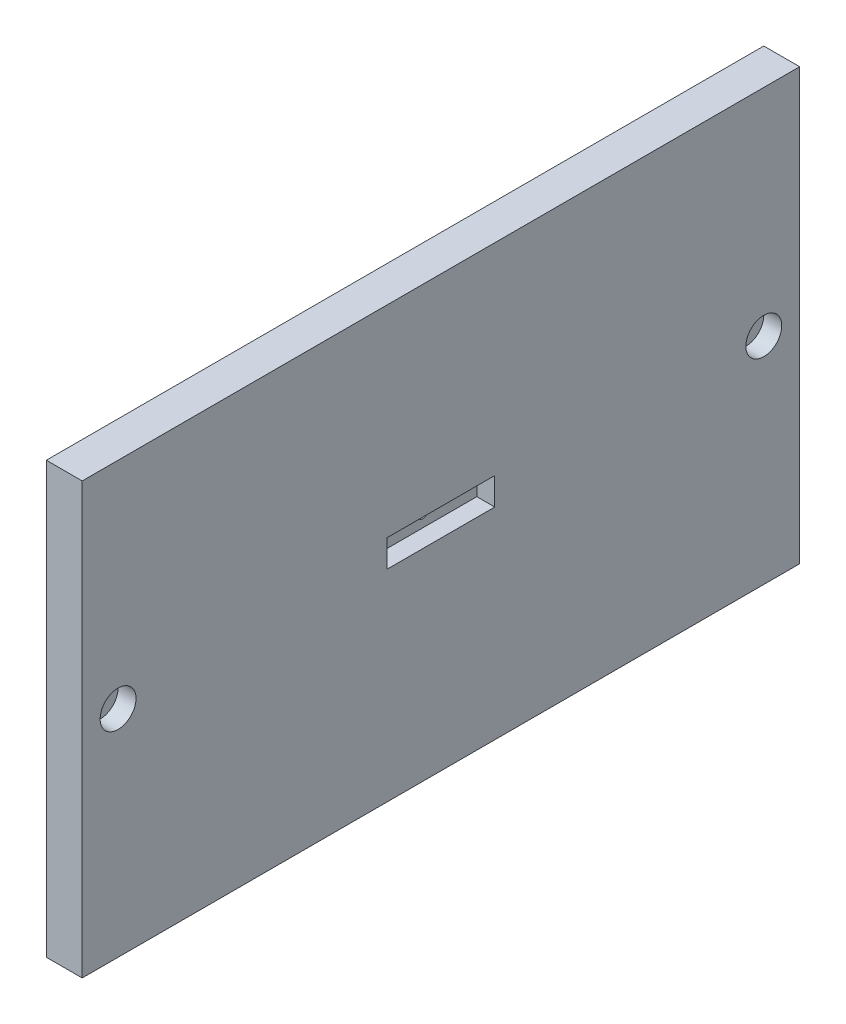
ISO-10303-21;
HEADER;
FILE_DESCRIPTION(('STEP AP214'),'2;1');
FILE_NAME('part.step','',(''),(''),'','','');
FILE_SCHEMA(('AUTOMOTIVE_DESIGN { 1 0 10303 214 1 1 1 1 }'));
ENDSEC;
DATA;
#1=APPLICATION_CONTEXT('core data for automotive mechanical design processes');
#2=APPLICATION_PROTOCOL_DEFINITION('international standard','automotive_design',2000,#1);
#3=PRODUCT_CONTEXT('',#1,'mechanical');
#4=PRODUCT('Part','Part','',(#3));
#5=PRODUCT_RELATED_PRODUCT_CATEGORY('part','',(#4));
#6=PRODUCT_DEFINITION_FORMATION('','',#4);
#7=PRODUCT_DEFINITION_CONTEXT('part definition',#1,'design');
#8=PRODUCT_DEFINITION('design','',#6,#7);
#9=PRODUCT_DEFINITION_SHAPE('','',#8);
#10=(LENGTH_UNIT() NAMED_UNIT(*) SI_UNIT(.MILLI.,.METRE.));
#11=(NAMED_UNIT(*) PLANE_ANGLE_UNIT() SI_UNIT($,.RADIAN.));
#12=(NAMED_UNIT(*) SI_UNIT($,.STERADIAN.) SOLID_ANGLE_UNIT());
#13=UNCERTAINTY_MEASURE_WITH_UNIT(LENGTH_MEASURE(1.E-05),#10,'distance_accuracy_value','');
#14=(GEOMETRIC_REPRESENTATION_CONTEXT(3) GLOBAL_UNCERTAINTY_ASSIGNED_CONTEXT((#13)) GLOBAL_UNIT_ASSIGNED_CONTEXT((#10,
#11,#12)) REPRESENTATION_CONTEXT('',''));
#15=CARTESIAN_POINT('',(0.,0.,0.));
#16=DIRECTION('',(0.,0.,1.));
#17=DIRECTION('',(1.,0.,0.));
#18=AXIS2_PLACEMENT_3D('',#15,#16,#17);
#19=CARTESIAN_POINT('',(12.7,-76.2,127.));
#20=DIRECTION('',(0.,0.,-1.));
#21=DIRECTION('',(-1.,0.,0.));
#22=AXIS2_PLACEMENT_3D('',#19,#20,#21);
#23=PLANE('',#22);
#24=DIRECTION('',(0.,-1.,0.));
#25=VECTOR('',#24,1.);
#26=CARTESIAN_POINT('',(0.,-76.2,127.));
#27=LINE('',#26,#25);
#28=CARTESIAN_POINT('',(0.,76.2,127.));
#29=VERTEX_POINT('',#28);
#30=CARTESIAN_POINT('',(0.,-76.2,127.));
#31=VERTEX_POINT('',#30);
#32=EDGE_CURVE('E179',#29,#31,#27,.T.);
#33=ORIENTED_EDGE('',*,*,#32,.T.);
#34=DIRECTION('',(-1.,0.,0.));
#35=VECTOR('',#34,1.);
#36=CARTESIAN_POINT('',(12.7,-76.2,127.));
#37=LINE('',#36,#35);
#38=CARTESIAN_POINT('',(12.7,-76.2,127.));
#39=VERTEX_POINT('',#38);
#40=EDGE_CURVE('E11',#39,#31,#37,.T.);
#41=ORIENTED_EDGE('',*,*,#40,.F.);
#42=DIRECTION('',(0.,-1.,0.));
#43=VECTOR('',#42,1.);
#44=CARTESIAN_POINT('',(12.7,-76.2,127.));
#45=LINE('',#44,#43);
#46=CARTESIAN_POINT('',(12.7,76.2,127.));
#47=VERTEX_POINT('',#46);
#48=EDGE_CURVE('E188',#47,#39,#45,.T.);
#49=ORIENTED_EDGE('',*,*,#48,.F.);
#50=DIRECTION('',(-1.,0.,0.));
#51=VECTOR('',#50,1.);
#52=CARTESIAN_POINT('',(12.7,76.2,127.));
#53=LINE('',#52,#51);
#54=EDGE_CURVE('E194',#47,#29,#53,.T.);
#55=ORIENTED_EDGE('',*,*,#54,.T.);
#56=EDGE_LOOP('',(#33,#41,#49,#55));
#57=FACE_BOUND('',#56,.T.);
#58=ADVANCED_FACE('F34',(#57),#23,.F.);
#59=CARTESIAN_POINT('',(12.7,-76.2,-127.));
#60=DIRECTION('',(0.,1.,0.));
#61=DIRECTION('',(0.,0.,1.));
#62=AXIS2_PLACEMENT_3D('',#59,#60,#61);
#63=PLANE('',#62);
#64=CARTESIAN_POINT('',(6.23633701428616,-76.2,114.3));
#65=DIRECTION('',(0.,-1.,0.));
#66=DIRECTION('',(0.,0.,-1.));
#67=AXIS2_PLACEMENT_3D('',#64,#65,#66);
#68=CIRCLE('',#67,3.17499999999999);
#69=CARTESIAN_POINT('',(6.23633701428616,-76.2,111.125));
#70=VERTEX_POINT('',#69);
#71=EDGE_CURVE('E154',#70,#70,#68,.T.);
#72=ORIENTED_EDGE('',*,*,#71,.F.);
#73=EDGE_LOOP('',(#72));
#74=FACE_BOUND('',#73,.T.);
#75=CARTESIAN_POINT('',(6.23633701428616,-76.2,0.));
#76=DIRECTION('',(0.,-1.,0.));
#77=DIRECTION('',(0.,0.,-1.));
#78=AXIS2_PLACEMENT_3D('',#75,#76,#77);
#79=CIRCLE('',#78,3.17499999999999);
#80=CARTESIAN_POINT('',(6.23633701428616,-76.2,-3.175));
#81=VERTEX_POINT('',#80);
#82=EDGE_CURVE('E163',#81,#81,#79,.T.);
#83=ORIENTED_EDGE('',*,*,#82,.F.);
#84=EDGE_LOOP('',(#83));
#85=FACE_BOUND('',#84,.T.);
#86=CARTESIAN_POINT('',(6.23633701428616,-76.2,-114.3));
#87=DIRECTION('',(0.,-1.,0.));
#88=DIRECTION('',(0.,0.,-1.));
#89=AXIS2_PLACEMENT_3D('',#86,#87,#88);
#90=CIRCLE('',#89,3.17499999999999);
#91=CARTESIAN_POINT('',(6.23633701428616,-76.2,-117.475));
#92=VERTEX_POINT('',#91);
#93=EDGE_CURVE('E169',#92,#92,#90,.T.);
#94=ORIENTED_EDGE('',*,*,#93,.F.);
#95=EDGE_LOOP('',(#94));
#96=FACE_BOUND('',#95,.T.);
#97=DIRECTION('',(0.,0.,-1.));
#98=VECTOR('',#97,1.);
#99=CARTESIAN_POINT('',(0.,-76.2,-127.));
#100=LINE('',#99,#98);
#101=CARTESIAN_POINT('',(0.,-76.2,-127.));
#102=VERTEX_POINT('',#101);
#103=EDGE_CURVE('E197',#31,#102,#100,.T.);
#104=ORIENTED_EDGE('',*,*,#103,.T.);
#105=DIRECTION('',(-1.,0.,0.));
#106=VECTOR('',#105,1.);
#107=CARTESIAN_POINT('',(12.7,-76.2,-127.));
#108=LINE('',#107,#106);
#109=CARTESIAN_POINT('',(12.7,-76.2,-127.));
#110=VERTEX_POINT('',#109);
#111=EDGE_CURVE('E41',#110,#102,#108,.T.);
#112=ORIENTED_EDGE('',*,*,#111,.F.);
#113=DIRECTION('',(0.,0.,-1.));
#114=VECTOR('',#113,1.);
#115=CARTESIAN_POINT('',(12.7,-76.2,-127.));
#116=LINE('',#115,#114);
#117=EDGE_CURVE('E85',#39,#110,#116,.T.);
#118=ORIENTED_EDGE('',*,*,#117,.F.);
#119=ORIENTED_EDGE('',*,*,#40,.T.);
#120=EDGE_LOOP('',(#104,#112,#118,#119));
#121=FACE_BOUND('',#120,.T.);
#122=ADVANCED_FACE('F226',(#74,#85,#96,#121),#63,.F.);
#123=CARTESIAN_POINT('',(12.7,-76.2,-127.));
#124=DIRECTION('',(0.,0.,1.));
#125=DIRECTION('',(1.,0.,0.));
#126=AXIS2_PLACEMENT_3D('',#123,#124,#125);
#127=PLANE('',#126);
#128=DIRECTION('',(0.,1.,0.));
#129=VECTOR('',#128,1.);
#130=CARTESIAN_POINT('',(0.,-76.2,-127.));
#131=LINE('',#130,#129);
#132=CARTESIAN_POINT('',(0.,76.2,-127.));
#133=VERTEX_POINT('',#132);
#134=EDGE_CURVE('E199',#102,#133,#131,.T.);
#135=ORIENTED_EDGE('',*,*,#134,.T.);
#136=DIRECTION('',(-1.,0.,0.));
#137=VECTOR('',#136,1.);
#138=CARTESIAN_POINT('',(12.7,76.2,-127.));
#139=LINE('',#138,#137);
#140=CARTESIAN_POINT('',(12.7,76.2,-127.));
#141=VERTEX_POINT('',#140);
#142=EDGE_CURVE('E203',#141,#133,#139,.T.);
#143=ORIENTED_EDGE('',*,*,#142,.F.);
#144=DIRECTION('',(0.,1.,0.));
#145=VECTOR('',#144,1.);
#146=CARTESIAN_POINT('',(12.7,-76.2,-127.));
#147=LINE('',#146,#145);
#148=EDGE_CURVE('E191',#110,#141,#147,.T.);
#149=ORIENTED_EDGE('',*,*,#148,.F.);
#150=ORIENTED_EDGE('',*,*,#111,.T.);
#151=EDGE_LOOP('',(#135,#143,#149,#150));
#152=FACE_BOUND('',#151,.T.);
#153=ADVANCED_FACE('F208',(#152),#127,.F.);
#154=CARTESIAN_POINT('',(12.7,76.2,-127.));
#155=DIRECTION('',(0.,-1.,0.));
#156=DIRECTION('',(0.,0.,-1.));
#157=AXIS2_PLACEMENT_3D('',#154,#155,#156);
#158=PLANE('',#157);
#159=DIRECTION('',(0.,0.,1.));
#160=VECTOR('',#159,1.);
#161=CARTESIAN_POINT('',(0.,76.2,-127.));
#162=LINE('',#161,#160);
#163=EDGE_CURVE('E78',#133,#29,#162,.T.);
#164=ORIENTED_EDGE('',*,*,#163,.T.);
#165=ORIENTED_EDGE('',*,*,#54,.F.);
#166=DIRECTION('',(0.,0.,1.));
#167=VECTOR('',#166,1.);
#168=CARTESIAN_POINT('',(12.7,76.2,-127.));
#169=LINE('',#168,#167);
#170=EDGE_CURVE('E57',#141,#47,#169,.T.);
#171=ORIENTED_EDGE('',*,*,#170,.F.);
#172=ORIENTED_EDGE('',*,*,#142,.T.);
#173=EDGE_LOOP('',(#164,#165,#171,#172));
#174=FACE_BOUND('',#173,.T.);
#175=ADVANCED_FACE('F216',(#174),#158,.F.);
#176=CARTESIAN_POINT('',(12.7,0.,0.));
#177=DIRECTION('',(1.,0.,0.));
#178=DIRECTION('',(0.,0.,-1.));
#179=AXIS2_PLACEMENT_3D('',#176,#177,#178);
#180=PLANE('',#179);
#181=DIRECTION('',(0.,-1.,0.));
#182=VECTOR('',#181,1.);
#183=CARTESIAN_POINT('',(12.7,-4.826,19.05));
#184=LINE('',#183,#182);
#185=CARTESIAN_POINT('',(12.7,4.826,19.05));
#186=VERTEX_POINT('',#185);
#187=CARTESIAN_POINT('',(12.7,-4.826,19.05));
#188=VERTEX_POINT('',#187);
#189=EDGE_CURVE('E48',#186,#188,#184,.T.);
#190=ORIENTED_EDGE('',*,*,#189,.F.);
#191=DIRECTION('',(0.,0.,1.));
#192=VECTOR('',#191,1.);
#193=CARTESIAN_POINT('',(12.7,4.826,-19.05));
#194=LINE('',#193,#192);
#195=CARTESIAN_POINT('',(12.7,4.826,-19.05));
#196=VERTEX_POINT('',#195);
#197=EDGE_CURVE('E136',#196,#186,#194,.T.);
#198=ORIENTED_EDGE('',*,*,#197,.F.);
#199=DIRECTION('',(0.,1.,0.));
#200=VECTOR('',#199,1.);
#201=CARTESIAN_POINT('',(12.7,-4.826,-19.05));
#202=LINE('',#201,#200);
#203=CARTESIAN_POINT('',(12.7,-4.826,-19.05));
#204=VERTEX_POINT('',#203);
#205=EDGE_CURVE('E139',#204,#196,#202,.T.);
#206=ORIENTED_EDGE('',*,*,#205,.F.);
#207=DIRECTION('',(0.,0.,-1.));
#208=VECTOR('',#207,1.);
#209=CARTESIAN_POINT('',(12.7,-4.826,-19.05));
#210=LINE('',#209,#208);
#211=EDGE_CURVE('E148',#188,#204,#210,.T.);
#212=ORIENTED_EDGE('',*,*,#211,.F.);
#213=EDGE_LOOP('',(#190,#198,#206,#212));
#214=FACE_BOUND('',#213,.T.);
#215=CARTESIAN_POINT('',(12.7,0.,-114.3));
#216=DIRECTION('',(1.,0.,0.));
#217=DIRECTION('',(0.,0.,-1.));
#218=AXIS2_PLACEMENT_3D('',#215,#216,#217);
#219=CIRCLE('',#218,6.35);
#220=CARTESIAN_POINT('',(12.7,0.,-120.65));
#221=VERTEX_POINT('',#220);
#222=EDGE_CURVE('E180',#221,#221,#219,.T.);
#223=ORIENTED_EDGE('',*,*,#222,.F.);
#224=EDGE_LOOP('',(#223));
#225=FACE_BOUND('',#224,.T.);
#226=CARTESIAN_POINT('',(12.7,0.,114.3));
#227=DIRECTION('',(1.,0.,0.));
#228=DIRECTION('',(0.,0.,-1.));
#229=AXIS2_PLACEMENT_3D('',#226,#227,#228);
#230=CIRCLE('',#229,6.35);
#231=CARTESIAN_POINT('',(12.7,0.,107.95));
#232=VERTEX_POINT('',#231);
#233=EDGE_CURVE('E175',#232,#232,#230,.T.);
#234=ORIENTED_EDGE('',*,*,#233,.F.);
#235=EDGE_LOOP('',(#234));
#236=FACE_BOUND('',#235,.T.);
#237=ORIENTED_EDGE('',*,*,#48,.T.);
#238=ORIENTED_EDGE('',*,*,#117,.T.);
#239=ORIENTED_EDGE('',*,*,#148,.T.);
#240=ORIENTED_EDGE('',*,*,#170,.T.);
#241=EDGE_LOOP('',(#237,#238,#239,#240));
#242=FACE_BOUND('',#241,.T.);
#243=ADVANCED_FACE('F218',(#214,#225,#236,#242),#180,.T.);
#244=CARTESIAN_POINT('',(0.,0.,0.));
#245=DIRECTION('',(1.,0.,0.));
#246=DIRECTION('',(0.,0.,-1.));
#247=AXIS2_PLACEMENT_3D('',#244,#245,#246);
#248=PLANE('',#247);
#249=CARTESIAN_POINT('',(0.,0.,0.));
#250=DIRECTION('',(1.,0.,0.));
#251=DIRECTION('',(0.,0.,-1.));
#252=AXIS2_PLACEMENT_3D('',#249,#250,#251);
#253=CIRCLE('',#252,2.6543);
#254=CARTESIAN_POINT('',(0.,0.,-2.65429999999999));
#255=VERTEX_POINT('',#254);
#256=EDGE_CURVE('E281',#255,#255,#253,.T.);
#257=ORIENTED_EDGE('',*,*,#256,.T.);
#258=EDGE_LOOP('',(#257));
#259=FACE_BOUND('',#258,.T.);
#260=ORIENTED_EDGE('',*,*,#32,.F.);
#261=ORIENTED_EDGE('',*,*,#163,.F.);
#262=ORIENTED_EDGE('',*,*,#134,.F.);
#263=ORIENTED_EDGE('',*,*,#103,.F.);
#264=EDGE_LOOP('',(#260,#261,#262,#263));
#265=FACE_BOUND('',#264,.T.);
#266=ADVANCED_FACE('F212',(#259,#265),#248,.F.);
#267=CARTESIAN_POINT('',(6.35,0.,114.3));
#268=DIRECTION('',(1.,0.,0.));
#269=DIRECTION('',(0.,0.,-1.));
#270=AXIS2_PLACEMENT_3D('',#267,#268,#269);
#271=CYLINDRICAL_SURFACE('',#270,6.35);
#272=CARTESIAN_POINT('',(6.35,0.,114.3));
#273=DIRECTION('',(1.,0.,0.));
#274=DIRECTION('',(0.,0.,-1.));
#275=AXIS2_PLACEMENT_3D('',#272,#273,#274);
#276=CIRCLE('',#275,6.35);
#277=CARTESIAN_POINT('',(6.35,0.,107.95));
#278=VERTEX_POINT('',#277);
#279=EDGE_CURVE('E183',#278,#278,#276,.T.);
#280=ORIENTED_EDGE('',*,*,#279,.F.);
#281=EDGE_LOOP('',(#280));
#282=FACE_BOUND('',#281,.T.);
#283=ORIENTED_EDGE('',*,*,#233,.T.);
#284=EDGE_LOOP('',(#283));
#285=FACE_BOUND('',#284,.T.);
#286=ADVANCED_FACE('F271',(#282,#285),#271,.F.);
#287=CARTESIAN_POINT('',(6.35,0.,114.3));
#288=DIRECTION('',(1.,0.,0.));
#289=DIRECTION('',(0.,0.,-1.));
#290=AXIS2_PLACEMENT_3D('',#287,#288,#289);
#291=PLANE('',#290);
#292=ORIENTED_EDGE('',*,*,#279,.T.);
#293=EDGE_LOOP('',(#292));
#294=FACE_BOUND('',#293,.T.);
#295=ADVANCED_FACE('F267',(#294),#291,.T.);
#296=CARTESIAN_POINT('',(6.35,0.,-114.3));
#297=DIRECTION('',(1.,0.,0.));
#298=DIRECTION('',(0.,0.,-1.));
#299=AXIS2_PLACEMENT_3D('',#296,#297,#298);
#300=CYLINDRICAL_SURFACE('',#299,6.35);
#301=CARTESIAN_POINT('',(6.35,0.,-114.3));
#302=DIRECTION('',(1.,0.,0.));
#303=DIRECTION('',(0.,0.,-1.));
#304=AXIS2_PLACEMENT_3D('',#301,#302,#303);
#305=CIRCLE('',#304,6.35);
#306=CARTESIAN_POINT('',(6.35,0.,-120.65));
#307=VERTEX_POINT('',#306);
#308=EDGE_CURVE('E176',#307,#307,#305,.T.);
#309=ORIENTED_EDGE('',*,*,#308,.F.);
#310=EDGE_LOOP('',(#309));
#311=FACE_BOUND('',#310,.T.);
#312=ORIENTED_EDGE('',*,*,#222,.T.);
#313=EDGE_LOOP('',(#312));
#314=FACE_BOUND('',#313,.T.);
#315=ADVANCED_FACE('F263',(#311,#314),#300,.F.);
#316=CARTESIAN_POINT('',(6.35,0.,-114.3));
#317=DIRECTION('',(1.,0.,0.));
#318=DIRECTION('',(0.,0.,-1.));
#319=AXIS2_PLACEMENT_3D('',#316,#317,#318);
#320=PLANE('',#319);
#321=ORIENTED_EDGE('',*,*,#308,.T.);
#322=EDGE_LOOP('',(#321));
#323=FACE_BOUND('',#322,.T.);
#324=ADVANCED_FACE('F255',(#323),#320,.T.);
#325=CARTESIAN_POINT('',(6.23633701428616,-63.5,-114.3));
#326=DIRECTION('',(0.,-1.,0.));
#327=DIRECTION('',(0.,0.,-1.));
#328=AXIS2_PLACEMENT_3D('',#325,#326,#327);
#329=CONICAL_SURFACE('',#328,3.17499999999999,1.02974425867665);
#330=CARTESIAN_POINT('',(6.23633701428616,-61.5922675345875,-114.3));
#331=VERTEX_POINT('',#330);
#332=VERTEX_LOOP('',#331);
#333=FACE_BOUND('',#332,.T.);
#334=CARTESIAN_POINT('',(6.23633701428616,-63.5,-114.3));
#335=DIRECTION('',(0.,-1.,0.));
#336=DIRECTION('',(0.,0.,-1.));
#337=AXIS2_PLACEMENT_3D('',#334,#335,#336);
#338=CIRCLE('',#337,3.17499999999999);
#339=CARTESIAN_POINT('',(6.23633701428616,-63.5,-117.475));
#340=VERTEX_POINT('',#339);
#341=EDGE_CURVE('E172',#340,#340,#338,.T.);
#342=ORIENTED_EDGE('',*,*,#341,.T.);
#343=EDGE_LOOP('',(#342));
#344=FACE_BOUND('',#343,.T.);
#345=ADVANCED_FACE('F245',(#333,#344),#329,.F.);
#346=CARTESIAN_POINT('',(6.23633701428616,-76.2,-114.3));
#347=DIRECTION('',(0.,-1.,0.));
#348=DIRECTION('',(0.,0.,-1.));
#349=AXIS2_PLACEMENT_3D('',#346,#347,#348);
#350=CYLINDRICAL_SURFACE('',#349,3.17499999999999);
#351=ORIENTED_EDGE('',*,*,#341,.F.);
#352=EDGE_LOOP('',(#351));
#353=FACE_BOUND('',#352,.T.);
#354=ORIENTED_EDGE('',*,*,#93,.T.);
#355=EDGE_LOOP('',(#354));
#356=FACE_BOUND('',#355,.T.);
#357=ADVANCED_FACE('F242',(#353,#356),#350,.F.);
#358=CARTESIAN_POINT('',(6.23633701428616,-63.5,0.));
#359=DIRECTION('',(0.,-1.,0.));
#360=DIRECTION('',(0.,0.,-1.));
#361=AXIS2_PLACEMENT_3D('',#358,#359,#360);
#362=CONICAL_SURFACE('',#361,3.17499999999999,1.02974425867665);
#363=CARTESIAN_POINT('',(6.23633701428616,-61.5922675345875,0.));
#364=VERTEX_POINT('',#363);
#365=VERTEX_LOOP('',#364);
#366=FACE_BOUND('',#365,.T.);
#367=CARTESIAN_POINT('',(6.23633701428616,-63.5,0.));
#368=DIRECTION('',(0.,-1.,0.));
#369=DIRECTION('',(0.,0.,-1.));
#370=AXIS2_PLACEMENT_3D('',#367,#368,#369);
#371=CIRCLE('',#370,3.17499999999999);
#372=CARTESIAN_POINT('',(6.23633701428616,-63.5,-3.17499999999999));
#373=VERTEX_POINT('',#372);
#374=EDGE_CURVE('E166',#373,#373,#371,.T.);
#375=ORIENTED_EDGE('',*,*,#374,.T.);
#376=EDGE_LOOP('',(#375));
#377=FACE_BOUND('',#376,.T.);
#378=ADVANCED_FACE('F244',(#366,#377),#362,.F.);
#379=CARTESIAN_POINT('',(6.23633701428616,-76.2,0.));
#380=DIRECTION('',(0.,-1.,0.));
#381=DIRECTION('',(0.,0.,-1.));
#382=AXIS2_PLACEMENT_3D('',#379,#380,#381);
#383=CYLINDRICAL_SURFACE('',#382,3.17499999999999);
#384=ORIENTED_EDGE('',*,*,#374,.F.);
#385=EDGE_LOOP('',(#384));
#386=FACE_BOUND('',#385,.T.);
#387=ORIENTED_EDGE('',*,*,#82,.T.);
#388=EDGE_LOOP('',(#387));
#389=FACE_BOUND('',#388,.T.);
#390=ADVANCED_FACE('F252',(#386,#389),#383,.F.);
#391=CARTESIAN_POINT('',(6.23633701428616,-63.5,114.3));
#392=DIRECTION('',(0.,-1.,0.));
#393=DIRECTION('',(0.,0.,-1.));
#394=AXIS2_PLACEMENT_3D('',#391,#392,#393);
#395=CONICAL_SURFACE('',#394,3.17499999999999,1.02974425867665);
#396=CARTESIAN_POINT('',(6.23633701428616,-61.5922675345875,114.3));
#397=VERTEX_POINT('',#396);
#398=VERTEX_LOOP('',#397);
#399=FACE_BOUND('',#398,.T.);
#400=CARTESIAN_POINT('',(6.23633701428616,-63.5,114.3));
#401=DIRECTION('',(0.,-1.,0.));
#402=DIRECTION('',(0.,0.,-1.));
#403=AXIS2_PLACEMENT_3D('',#400,#401,#402);
#404=CIRCLE('',#403,3.17499999999999);
#405=CARTESIAN_POINT('',(6.23633701428616,-63.5,111.125));
#406=VERTEX_POINT('',#405);
#407=EDGE_CURVE('E160',#406,#406,#404,.T.);
#408=ORIENTED_EDGE('',*,*,#407,.T.);
#409=EDGE_LOOP('',(#408));
#410=FACE_BOUND('',#409,.T.);
#411=ADVANCED_FACE('F319',(#399,#410),#395,.F.);
#412=CARTESIAN_POINT('',(6.23633701428616,-76.2,114.3));
#413=DIRECTION('',(0.,-1.,0.));
#414=DIRECTION('',(0.,0.,-1.));
#415=AXIS2_PLACEMENT_3D('',#412,#413,#414);
#416=CYLINDRICAL_SURFACE('',#415,3.17499999999999);
#417=ORIENTED_EDGE('',*,*,#407,.F.);
#418=EDGE_LOOP('',(#417));
#419=FACE_BOUND('',#418,.T.);
#420=ORIENTED_EDGE('',*,*,#71,.T.);
#421=EDGE_LOOP('',(#420));
#422=FACE_BOUND('',#421,.T.);
#423=ADVANCED_FACE('F316',(#419,#422),#416,.F.);
#424=CARTESIAN_POINT('',(6.35,-4.826,19.05));
#425=DIRECTION('',(0.,0.,1.));
#426=DIRECTION('',(1.,0.,0.));
#427=AXIS2_PLACEMENT_3D('',#424,#425,#426);
#428=PLANE('',#427);
#429=ORIENTED_EDGE('',*,*,#189,.T.);
#430=DIRECTION('',(1.,0.,0.));
#431=VECTOR('',#430,1.);
#432=CARTESIAN_POINT('',(6.35,-4.826,19.05));
#433=LINE('',#432,#431);
#434=CARTESIAN_POINT('',(6.35,-4.826,19.05));
#435=VERTEX_POINT('',#434);
#436=EDGE_CURVE('E114',#435,#188,#433,.T.);
#437=ORIENTED_EDGE('',*,*,#436,.F.);
#438=DIRECTION('',(0.,-1.,0.));
#439=VECTOR('',#438,1.);
#440=CARTESIAN_POINT('',(6.35,-4.826,19.05));
#441=LINE('',#440,#439);
#442=CARTESIAN_POINT('',(6.35,4.826,19.05));
#443=VERTEX_POINT('',#442);
#444=EDGE_CURVE('E118',#443,#435,#441,.T.);
#445=ORIENTED_EDGE('',*,*,#444,.F.);
#446=DIRECTION('',(1.,0.,0.));
#447=VECTOR('',#446,1.);
#448=CARTESIAN_POINT('',(6.35,4.826,19.05));
#449=LINE('',#448,#447);
#450=EDGE_CURVE('E152',#443,#186,#449,.T.);
#451=ORIENTED_EDGE('',*,*,#450,.T.);
#452=EDGE_LOOP('',(#429,#437,#445,#451));
#453=FACE_BOUND('',#452,.T.);
#454=ADVANCED_FACE('F116',(#453),#428,.F.);
#455=CARTESIAN_POINT('',(6.35,4.826,-19.05));
#456=DIRECTION('',(0.,1.,0.));
#457=DIRECTION('',(0.,0.,1.));
#458=AXIS2_PLACEMENT_3D('',#455,#456,#457);
#459=PLANE('',#458);
#460=ORIENTED_EDGE('',*,*,#197,.T.);
#461=ORIENTED_EDGE('',*,*,#450,.F.);
#462=DIRECTION('',(0.,0.,1.));
#463=VECTOR('',#462,1.);
#464=CARTESIAN_POINT('',(6.35,4.826,-19.05));
#465=LINE('',#464,#463);
#466=CARTESIAN_POINT('',(6.35,4.826,-19.05));
#467=VERTEX_POINT('',#466);
#468=EDGE_CURVE('E124',#467,#443,#465,.T.);
#469=ORIENTED_EDGE('',*,*,#468,.F.);
#470=DIRECTION('',(1.,0.,0.));
#471=VECTOR('',#470,1.);
#472=CARTESIAN_POINT('',(6.35,4.826,-19.05));
#473=LINE('',#472,#471);
#474=EDGE_CURVE('E155',#467,#196,#473,.T.);
#475=ORIENTED_EDGE('',*,*,#474,.T.);
#476=EDGE_LOOP('',(#460,#461,#469,#475));
#477=FACE_BOUND('',#476,.T.);
#478=ADVANCED_FACE('F304',(#477),#459,.F.);
#479=CARTESIAN_POINT('',(6.35,-4.826,-19.05));
#480=DIRECTION('',(0.,0.,-1.));
#481=DIRECTION('',(-1.,0.,0.));
#482=AXIS2_PLACEMENT_3D('',#479,#480,#481);
#483=PLANE('',#482);
#484=ORIENTED_EDGE('',*,*,#205,.T.);
#485=ORIENTED_EDGE('',*,*,#474,.F.);
#486=DIRECTION('',(0.,1.,0.));
#487=VECTOR('',#486,1.);
#488=CARTESIAN_POINT('',(6.35,-4.826,-19.05));
#489=LINE('',#488,#487);
#490=CARTESIAN_POINT('',(6.35,-4.826,-19.05));
#491=VERTEX_POINT('',#490);
#492=EDGE_CURVE('E132',#491,#467,#489,.T.);
#493=ORIENTED_EDGE('',*,*,#492,.F.);
#494=DIRECTION('',(1.,0.,0.));
#495=VECTOR('',#494,1.);
#496=CARTESIAN_POINT('',(6.35,-4.826,-19.05));
#497=LINE('',#496,#495);
#498=EDGE_CURVE('E123',#491,#204,#497,.T.);
#499=ORIENTED_EDGE('',*,*,#498,.T.);
#500=EDGE_LOOP('',(#484,#485,#493,#499));
#501=FACE_BOUND('',#500,.T.);
#502=ADVANCED_FACE('F307',(#501),#483,.F.);
#503=CARTESIAN_POINT('',(6.35,-4.826,-19.05));
#504=DIRECTION('',(0.,-1.,0.));
#505=DIRECTION('',(0.,0.,-1.));
#506=AXIS2_PLACEMENT_3D('',#503,#504,#505);
#507=PLANE('',#506);
#508=ORIENTED_EDGE('',*,*,#211,.T.);
#509=ORIENTED_EDGE('',*,*,#498,.F.);
#510=DIRECTION('',(0.,0.,-1.));
#511=VECTOR('',#510,1.);
#512=CARTESIAN_POINT('',(6.35,-4.826,-19.05));
#513=LINE('',#512,#511);
#514=EDGE_CURVE('E127',#435,#491,#513,.T.);
#515=ORIENTED_EDGE('',*,*,#514,.F.);
#516=ORIENTED_EDGE('',*,*,#436,.T.);
#517=EDGE_LOOP('',(#508,#509,#515,#516));
#518=FACE_BOUND('',#517,.T.);
#519=ADVANCED_FACE('F128',(#518),#507,.F.);
#520=CARTESIAN_POINT('',(6.35,0.,0.));
#521=DIRECTION('',(1.,0.,0.));
#522=DIRECTION('',(0.,0.,-1.));
#523=AXIS2_PLACEMENT_3D('',#520,#521,#522);
#524=PLANE('',#523);
#525=CARTESIAN_POINT('',(6.35,0.,0.));
#526=DIRECTION('',(1.,0.,0.));
#527=DIRECTION('',(0.,0.,-1.));
#528=AXIS2_PLACEMENT_3D('',#525,#526,#527);
#529=CIRCLE('',#528,2.01929999999999);
#530=CARTESIAN_POINT('',(6.35,0.,-2.01929999999998));
#531=VERTEX_POINT('',#530);
#532=EDGE_CURVE('E283',#531,#531,#529,.T.);
#533=ORIENTED_EDGE('',*,*,#532,.F.);
#534=EDGE_LOOP('',(#533));
#535=FACE_BOUND('',#534,.T.);
#536=ORIENTED_EDGE('',*,*,#444,.T.);
#537=ORIENTED_EDGE('',*,*,#514,.T.);
#538=ORIENTED_EDGE('',*,*,#492,.T.);
#539=ORIENTED_EDGE('',*,*,#468,.T.);
#540=EDGE_LOOP('',(#536,#537,#538,#539));
#541=FACE_BOUND('',#540,.T.);
#542=ADVANCED_FACE('F134',(#535,#541),#524,.T.);
#543=CARTESIAN_POINT('',(0.635000000000001,0.,0.));
#544=DIRECTION('',(-1.,0.,0.));
#545=DIRECTION('',(0.,0.,1.));
#546=AXIS2_PLACEMENT_3D('',#543,#544,#545);
#547=CONICAL_SURFACE('',#546,2.0193,0.785398163397448);
#548=ORIENTED_EDGE('',*,*,#256,.F.);
#549=EDGE_LOOP('',(#548));
#550=FACE_BOUND('',#549,.T.);
#551=CARTESIAN_POINT('',(0.635000000000001,0.,0.));
#552=DIRECTION('',(1.,0.,0.));
#553=DIRECTION('',(0.,0.,-1.));
#554=AXIS2_PLACEMENT_3D('',#551,#552,#553);
#555=CIRCLE('',#554,2.0193);
#556=CARTESIAN_POINT('',(0.635000000000001,0.,-2.01929999999999));
#557=VERTEX_POINT('',#556);
#558=EDGE_CURVE('E142',#557,#557,#555,.T.);
#559=ORIENTED_EDGE('',*,*,#558,.T.);
#560=EDGE_LOOP('',(#559));
#561=FACE_BOUND('',#560,.T.);
#562=ADVANCED_FACE('F291',(#550,#561),#547,.F.);
#563=CARTESIAN_POINT('',(6.35,0.,0.));
#564=DIRECTION('',(1.,0.,0.));
#565=DIRECTION('',(0.,0.,-1.));
#566=AXIS2_PLACEMENT_3D('',#563,#564,#565);
#567=CYLINDRICAL_SURFACE('',#566,2.01929999999999);
#568=ORIENTED_EDGE('',*,*,#558,.F.);
#569=EDGE_LOOP('',(#568));
#570=FACE_BOUND('',#569,.T.);
#571=ORIENTED_EDGE('',*,*,#532,.T.);
#572=EDGE_LOOP('',(#571));
#573=FACE_BOUND('',#572,.T.);
#574=ADVANCED_FACE('F293',(#570,#573),#567,.F.);
#575=CLOSED_SHELL('',(#58,#122,#153,#175,#243,#266,#286,#295,#315,#324,#345,#357,#378,#390,#411,
#423,#454,#478,#502,#519,#542,#562,#574));
#576=MANIFOLD_SOLID_BREP('B2',#575);
#577=ADVANCED_BREP_SHAPE_REPRESENTATION('',(#18,#576),#14);
#578=SHAPE_DEFINITION_REPRESENTATION(#9,#577);
ENDSEC;
END-ISO-10303-21;
